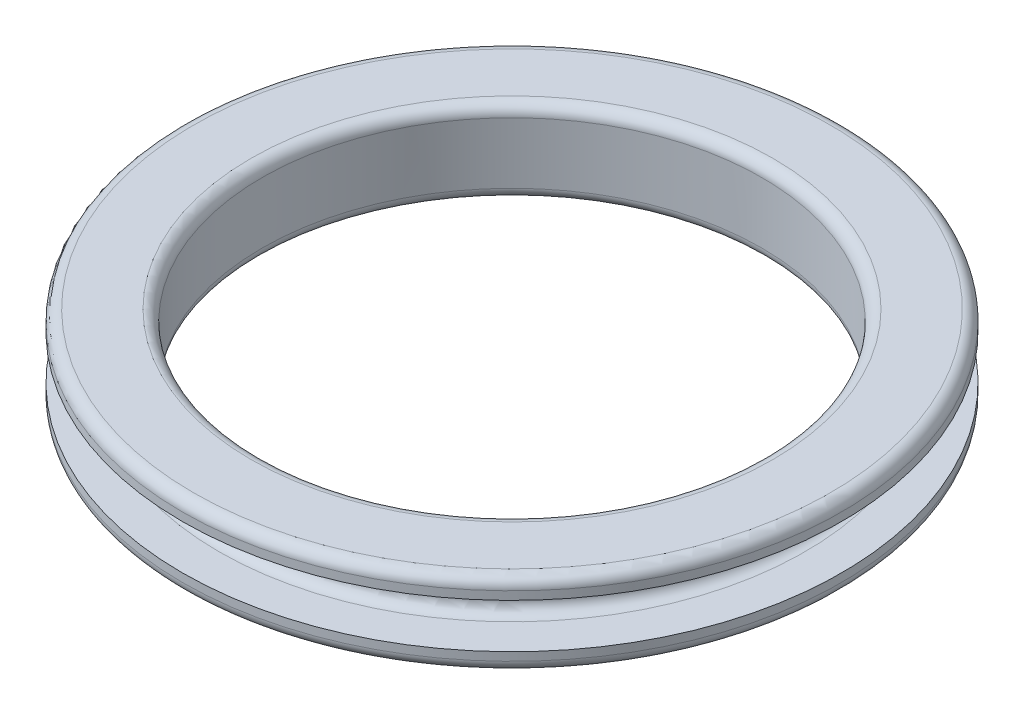
ISO-10303-21;
HEADER;
FILE_DESCRIPTION(('STEP AP214'),'2;1');
FILE_NAME('part.step','',(''),(''),'','','');
FILE_SCHEMA(('AUTOMOTIVE_DESIGN { 1 0 10303 214 1 1 1 1 }'));
ENDSEC;
DATA;
#1=APPLICATION_CONTEXT('core data for automotive mechanical design processes');
#2=APPLICATION_PROTOCOL_DEFINITION('international standard','automotive_design',2000,#1);
#3=PRODUCT_CONTEXT('',#1,'mechanical');
#4=PRODUCT('Part','Part','',(#3));
#5=PRODUCT_RELATED_PRODUCT_CATEGORY('part','',(#4));
#6=PRODUCT_DEFINITION_FORMATION('','',#4);
#7=PRODUCT_DEFINITION_CONTEXT('part definition',#1,'design');
#8=PRODUCT_DEFINITION('design','',#6,#7);
#9=PRODUCT_DEFINITION_SHAPE('','',#8);
#10=(LENGTH_UNIT() NAMED_UNIT(*) SI_UNIT(.MILLI.,.METRE.));
#11=(NAMED_UNIT(*) PLANE_ANGLE_UNIT() SI_UNIT($,.RADIAN.));
#12=(NAMED_UNIT(*) SI_UNIT($,.STERADIAN.) SOLID_ANGLE_UNIT());
#13=UNCERTAINTY_MEASURE_WITH_UNIT(LENGTH_MEASURE(1.E-05),#10,'distance_accuracy_value','');
#14=(GEOMETRIC_REPRESENTATION_CONTEXT(3) GLOBAL_UNCERTAINTY_ASSIGNED_CONTEXT((#13)) GLOBAL_UNIT_ASSIGNED_CONTEXT((#10,
#11,#12)) REPRESENTATION_CONTEXT('',''));
#15=CARTESIAN_POINT('',(0.,0.,0.));
#16=DIRECTION('',(0.,0.,1.));
#17=DIRECTION('',(1.,0.,0.));
#18=AXIS2_PLACEMENT_3D('',#15,#16,#17);
#19=CARTESIAN_POINT('',(-11.8717524104385,0.,0.));
#20=DIRECTION('',(0.,-1.,0.));
#21=DIRECTION('',(0.,0.,-1.));
#22=AXIS2_PLACEMENT_3D('',#19,#20,#21);
#23=PLANE('',#22);
#24=CARTESIAN_POINT('',(0.,0.,0.));
#25=DIRECTION('',(0.,-1.,0.));
#26=DIRECTION('',(0.,0.,-1.));
#27=AXIS2_PLACEMENT_3D('',#24,#25,#26);
#28=CIRCLE('',#27,11.4717524104385);
#29=CARTESIAN_POINT('',(0.,0.,-11.4717524104385));
#30=VERTEX_POINT('',#29);
#31=EDGE_CURVE('E68',#30,#30,#28,.T.);
#32=ORIENTED_EDGE('',*,*,#31,.T.);
#33=EDGE_LOOP('',(#32));
#34=FACE_BOUND('',#33,.T.);
#35=CARTESIAN_POINT('',(0.,0.,0.));
#36=DIRECTION('',(0.,-1.,0.));
#37=DIRECTION('',(0.,0.,-1.));
#38=AXIS2_PLACEMENT_3D('',#35,#36,#37);
#39=CIRCLE('',#38,9.4);
#40=CARTESIAN_POINT('',(0.,0.,-9.4));
#41=VERTEX_POINT('',#40);
#42=EDGE_CURVE('E71',#41,#41,#39,.F.);
#43=ORIENTED_EDGE('',*,*,#42,.T.);
#44=EDGE_LOOP('',(#43));
#45=FACE_BOUND('',#44,.T.);
#46=ADVANCED_FACE('F33',(#34,#45),#23,.T.);
#47=CARTESIAN_POINT('',(0.,7.24686622926984,0.));
#48=DIRECTION('',(0.,1.,0.));
#49=DIRECTION('',(0.,0.,1.));
#50=AXIS2_PLACEMENT_3D('',#47,#48,#49);
#51=CYLINDRICAL_SURFACE('',#50,9.);
#52=CARTESIAN_POINT('',(0.,0.4,0.));
#53=DIRECTION('',(0.,-1.,0.));
#54=DIRECTION('',(0.,0.,-1.));
#55=AXIS2_PLACEMENT_3D('',#52,#53,#54);
#56=CIRCLE('',#55,9.);
#57=CARTESIAN_POINT('',(0.,0.4,-9.));
#58=VERTEX_POINT('',#57);
#59=EDGE_CURVE('E10',#58,#58,#56,.T.);
#60=ORIENTED_EDGE('',*,*,#59,.T.);
#61=EDGE_LOOP('',(#60));
#62=FACE_BOUND('',#61,.T.);
#63=CARTESIAN_POINT('',(0.,2.6,0.));
#64=DIRECTION('',(0.,1.,0.));
#65=DIRECTION('',(0.,0.,1.));
#66=AXIS2_PLACEMENT_3D('',#63,#64,#65);
#67=CIRCLE('',#66,9.);
#68=CARTESIAN_POINT('',(0.,2.6,9.));
#69=VERTEX_POINT('',#68);
#70=EDGE_CURVE('E40',#69,#69,#67,.T.);
#71=ORIENTED_EDGE('',*,*,#70,.T.);
#72=EDGE_LOOP('',(#71));
#73=FACE_BOUND('',#72,.T.);
#74=ADVANCED_FACE('F102',(#62,#73),#51,.F.);
#75=CARTESIAN_POINT('',(-9.,3.,0.));
#76=DIRECTION('',(0.,1.,0.));
#77=DIRECTION('',(0.,0.,1.));
#78=AXIS2_PLACEMENT_3D('',#75,#76,#77);
#79=PLANE('',#78);
#80=CARTESIAN_POINT('',(0.,3.,0.));
#81=DIRECTION('',(0.,1.,0.));
#82=DIRECTION('',(0.,0.,1.));
#83=AXIS2_PLACEMENT_3D('',#80,#81,#82);
#84=CIRCLE('',#83,11.4717524104385);
#85=CARTESIAN_POINT('',(0.,3.,11.4717524104385));
#86=VERTEX_POINT('',#85);
#87=EDGE_CURVE('E48',#86,#86,#84,.T.);
#88=ORIENTED_EDGE('',*,*,#87,.T.);
#89=EDGE_LOOP('',(#88));
#90=FACE_BOUND('',#89,.T.);
#91=CARTESIAN_POINT('',(0.,3.,0.));
#92=DIRECTION('',(0.,1.,0.));
#93=DIRECTION('',(0.,0.,1.));
#94=AXIS2_PLACEMENT_3D('',#91,#92,#93);
#95=CIRCLE('',#94,9.4);
#96=CARTESIAN_POINT('',(0.,3.,9.4));
#97=VERTEX_POINT('',#96);
#98=EDGE_CURVE('E53',#97,#97,#95,.F.);
#99=ORIENTED_EDGE('',*,*,#98,.T.);
#100=EDGE_LOOP('',(#99));
#101=FACE_BOUND('',#100,.T.);
#102=ADVANCED_FACE('F108',(#90,#101),#79,.T.);
#103=CARTESIAN_POINT('',(0.,7.24686622926984,0.));
#104=DIRECTION('',(0.,1.,0.));
#105=DIRECTION('',(0.,0.,1.));
#106=AXIS2_PLACEMENT_3D('',#103,#104,#105);
#107=CYLINDRICAL_SURFACE('',#106,11.8717524104385);
#108=CARTESIAN_POINT('',(0.,2.6,0.));
#109=DIRECTION('',(0.,1.,0.));
#110=DIRECTION('',(0.,0.,1.));
#111=AXIS2_PLACEMENT_3D('',#108,#109,#110);
#112=CIRCLE('',#111,11.8717524104385);
#113=CARTESIAN_POINT('',(0.,2.6,11.8717524104385));
#114=VERTEX_POINT('',#113);
#115=EDGE_CURVE('E44',#114,#114,#112,.F.);
#116=ORIENTED_EDGE('',*,*,#115,.T.);
#117=EDGE_LOOP('',(#116));
#118=FACE_BOUND('',#117,.T.);
#119=CARTESIAN_POINT('',(0.,2.3,0.));
#120=DIRECTION('',(0.,1.,0.));
#121=DIRECTION('',(0.,0.,1.));
#122=AXIS2_PLACEMENT_3D('',#119,#120,#121);
#123=CIRCLE('',#122,11.8717524104385);
#124=CARTESIAN_POINT('',(0.,2.3,11.8717524104385));
#125=VERTEX_POINT('',#124);
#126=EDGE_CURVE('E77',#125,#125,#123,.T.);
#127=ORIENTED_EDGE('',*,*,#126,.T.);
#128=EDGE_LOOP('',(#127));
#129=FACE_BOUND('',#128,.T.);
#130=ADVANCED_FACE('F138',(#118,#129),#107,.T.);
#131=CARTESIAN_POINT('',(-11.8717524104385,2.3,0.));
#132=DIRECTION('',(0.,-1.,0.));
#133=DIRECTION('',(0.,0.,-1.));
#134=AXIS2_PLACEMENT_3D('',#131,#132,#133);
#135=PLANE('',#134);
#136=CARTESIAN_POINT('',(0.,2.3,0.));
#137=DIRECTION('',(0.,-1.,0.));
#138=DIRECTION('',(0.,0.,-1.));
#139=AXIS2_PLACEMENT_3D('',#136,#137,#138);
#140=CIRCLE('',#139,10.5534134717167);
#141=CARTESIAN_POINT('',(0.,2.3,-10.5534134717167));
#142=VERTEX_POINT('',#141);
#143=EDGE_CURVE('E56',#142,#142,#140,.F.);
#144=ORIENTED_EDGE('',*,*,#143,.T.);
#145=EDGE_LOOP('',(#144));
#146=FACE_BOUND('',#145,.T.);
#147=ORIENTED_EDGE('',*,*,#126,.F.);
#148=EDGE_LOOP('',(#147));
#149=FACE_BOUND('',#148,.T.);
#150=ADVANCED_FACE('F143',(#146,#149),#135,.T.);
#151=CARTESIAN_POINT('',(0.,7.24686622926984,0.));
#152=DIRECTION('',(0.,1.,0.));
#153=DIRECTION('',(0.,0.,1.));
#154=AXIS2_PLACEMENT_3D('',#151,#152,#153);
#155=CYLINDRICAL_SURFACE('',#154,10.1534134717167);
#156=CARTESIAN_POINT('',(0.,1.1,0.));
#157=DIRECTION('',(0.,1.,0.));
#158=DIRECTION('',(0.,0.,1.));
#159=AXIS2_PLACEMENT_3D('',#156,#157,#158);
#160=CIRCLE('',#159,10.1534134717167);
#161=CARTESIAN_POINT('',(0.,1.1,10.1534134717167));
#162=VERTEX_POINT('',#161);
#163=EDGE_CURVE('E62',#162,#162,#160,.T.);
#164=ORIENTED_EDGE('',*,*,#163,.T.);
#165=EDGE_LOOP('',(#164));
#166=FACE_BOUND('',#165,.T.);
#167=CARTESIAN_POINT('',(0.,1.9,0.));
#168=DIRECTION('',(0.,-1.,0.));
#169=DIRECTION('',(0.,0.,-1.));
#170=AXIS2_PLACEMENT_3D('',#167,#168,#169);
#171=CIRCLE('',#170,10.1534134717167);
#172=CARTESIAN_POINT('',(0.,1.9,-10.1534134717167));
#173=VERTEX_POINT('',#172);
#174=EDGE_CURVE('E65',#173,#173,#171,.T.);
#175=ORIENTED_EDGE('',*,*,#174,.T.);
#176=EDGE_LOOP('',(#175));
#177=FACE_BOUND('',#176,.T.);
#178=ADVANCED_FACE('F98',(#166,#177),#155,.T.);
#179=CARTESIAN_POINT('',(-10.1534134717167,0.7,0.));
#180=DIRECTION('',(0.,1.,0.));
#181=DIRECTION('',(0.,0.,1.));
#182=AXIS2_PLACEMENT_3D('',#179,#180,#181);
#183=PLANE('',#182);
#184=CARTESIAN_POINT('',(0.,0.7,0.));
#185=DIRECTION('',(0.,1.,0.));
#186=DIRECTION('',(0.,0.,1.));
#187=AXIS2_PLACEMENT_3D('',#184,#185,#186);
#188=CIRCLE('',#187,10.5534134717167);
#189=CARTESIAN_POINT('',(0.,0.7,10.5534134717167));
#190=VERTEX_POINT('',#189);
#191=EDGE_CURVE('E59',#190,#190,#188,.F.);
#192=ORIENTED_EDGE('',*,*,#191,.T.);
#193=EDGE_LOOP('',(#192));
#194=FACE_BOUND('',#193,.T.);
#195=CARTESIAN_POINT('',(0.,0.7,0.));
#196=DIRECTION('',(0.,1.,0.));
#197=DIRECTION('',(0.,0.,1.));
#198=AXIS2_PLACEMENT_3D('',#195,#196,#197);
#199=CIRCLE('',#198,11.8717524104385);
#200=CARTESIAN_POINT('',(0.,0.7,11.8717524104385));
#201=VERTEX_POINT('',#200);
#202=EDGE_CURVE('E80',#201,#201,#199,.T.);
#203=ORIENTED_EDGE('',*,*,#202,.T.);
#204=EDGE_LOOP('',(#203));
#205=FACE_BOUND('',#204,.T.);
#206=ADVANCED_FACE('F84',(#194,#205),#183,.T.);
#207=CARTESIAN_POINT('',(0.,7.24686622926984,0.));
#208=DIRECTION('',(0.,1.,0.));
#209=DIRECTION('',(0.,0.,1.));
#210=AXIS2_PLACEMENT_3D('',#207,#208,#209);
#211=CYLINDRICAL_SURFACE('',#210,11.8717524104385);
#212=CARTESIAN_POINT('',(0.,0.4,0.));
#213=DIRECTION('',(0.,-1.,0.));
#214=DIRECTION('',(0.,0.,-1.));
#215=AXIS2_PLACEMENT_3D('',#212,#213,#214);
#216=CIRCLE('',#215,11.8717524104385);
#217=CARTESIAN_POINT('',(0.,0.4,-11.8717524104385));
#218=VERTEX_POINT('',#217);
#219=EDGE_CURVE('E74',#218,#218,#216,.F.);
#220=ORIENTED_EDGE('',*,*,#219,.T.);
#221=EDGE_LOOP('',(#220));
#222=FACE_BOUND('',#221,.T.);
#223=ORIENTED_EDGE('',*,*,#202,.F.);
#224=EDGE_LOOP('',(#223));
#225=FACE_BOUND('',#224,.T.);
#226=ADVANCED_FACE('F86',(#222,#225),#211,.T.);
#227=CARTESIAN_POINT('',(0.,0.4,0.));
#228=DIRECTION('',(0.,-1.,0.));
#229=DIRECTION('',(0.,0.,-1.));
#230=AXIS2_PLACEMENT_3D('',#227,#228,#229);
#231=TOROIDAL_SURFACE('',#230,11.4717524104385,0.4);
#232=ORIENTED_EDGE('',*,*,#31,.F.);
#233=EDGE_LOOP('',(#232));
#234=FACE_BOUND('',#233,.T.);
#235=ORIENTED_EDGE('',*,*,#219,.F.);
#236=EDGE_LOOP('',(#235));
#237=FACE_BOUND('',#236,.T.);
#238=ADVANCED_FACE('F88',(#234,#237),#231,.T.);
#239=CARTESIAN_POINT('',(0.,1.1,0.));
#240=DIRECTION('',(0.,1.,0.));
#241=DIRECTION('',(0.,0.,1.));
#242=AXIS2_PLACEMENT_3D('',#239,#240,#241);
#243=TOROIDAL_SURFACE('',#242,10.5534134717167,0.4);
#244=ORIENTED_EDGE('',*,*,#191,.F.);
#245=EDGE_LOOP('',(#244));
#246=FACE_BOUND('',#245,.T.);
#247=ORIENTED_EDGE('',*,*,#163,.F.);
#248=EDGE_LOOP('',(#247));
#249=FACE_BOUND('',#248,.T.);
#250=ADVANCED_FACE('F95',(#246,#249),#243,.F.);
#251=CARTESIAN_POINT('',(0.,1.9,0.));
#252=DIRECTION('',(0.,-1.,0.));
#253=DIRECTION('',(0.,0.,-1.));
#254=AXIS2_PLACEMENT_3D('',#251,#252,#253);
#255=TOROIDAL_SURFACE('',#254,10.5534134717167,0.4);
#256=ORIENTED_EDGE('',*,*,#174,.F.);
#257=EDGE_LOOP('',(#256));
#258=FACE_BOUND('',#257,.T.);
#259=ORIENTED_EDGE('',*,*,#143,.F.);
#260=EDGE_LOOP('',(#259));
#261=FACE_BOUND('',#260,.T.);
#262=ADVANCED_FACE('F115',(#258,#261),#255,.F.);
#263=CARTESIAN_POINT('',(0.,2.6,0.));
#264=DIRECTION('',(0.,1.,0.));
#265=DIRECTION('',(0.,0.,1.));
#266=AXIS2_PLACEMENT_3D('',#263,#264,#265);
#267=TOROIDAL_SURFACE('',#266,11.4717524104385,0.4);
#268=ORIENTED_EDGE('',*,*,#115,.F.);
#269=EDGE_LOOP('',(#268));
#270=FACE_BOUND('',#269,.T.);
#271=ORIENTED_EDGE('',*,*,#87,.F.);
#272=EDGE_LOOP('',(#271));
#273=FACE_BOUND('',#272,.T.);
#274=ADVANCED_FACE('F119',(#270,#273),#267,.T.);
#275=CARTESIAN_POINT('',(0.,0.4,0.));
#276=DIRECTION('',(0.,-1.,0.));
#277=DIRECTION('',(0.,0.,-1.));
#278=AXIS2_PLACEMENT_3D('',#275,#276,#277);
#279=TOROIDAL_SURFACE('',#278,9.4,0.4);
#280=ORIENTED_EDGE('',*,*,#59,.F.);
#281=EDGE_LOOP('',(#280));
#282=FACE_BOUND('',#281,.T.);
#283=ORIENTED_EDGE('',*,*,#42,.F.);
#284=EDGE_LOOP('',(#283));
#285=FACE_BOUND('',#284,.T.);
#286=ADVANCED_FACE('F122',(#282,#285),#279,.T.);
#287=CARTESIAN_POINT('',(0.,2.6,0.));
#288=DIRECTION('',(0.,1.,0.));
#289=DIRECTION('',(0.,0.,1.));
#290=AXIS2_PLACEMENT_3D('',#287,#288,#289);
#291=TOROIDAL_SURFACE('',#290,9.4,0.4);
#292=ORIENTED_EDGE('',*,*,#98,.F.);
#293=EDGE_LOOP('',(#292));
#294=FACE_BOUND('',#293,.T.);
#295=ORIENTED_EDGE('',*,*,#70,.F.);
#296=EDGE_LOOP('',(#295));
#297=FACE_BOUND('',#296,.T.);
#298=ADVANCED_FACE('F35',(#294,#297),#291,.T.);
#299=CLOSED_SHELL('',(#46,#74,#102,#130,#150,#178,#206,#226,#238,#250,#262,#274,#286,#298));
#300=MANIFOLD_SOLID_BREP('B2',#299);
#301=ADVANCED_BREP_SHAPE_REPRESENTATION('',(#18,#300),#14);
#302=SHAPE_DEFINITION_REPRESENTATION(#9,#301);
ENDSEC;
END-ISO-10303-21;
